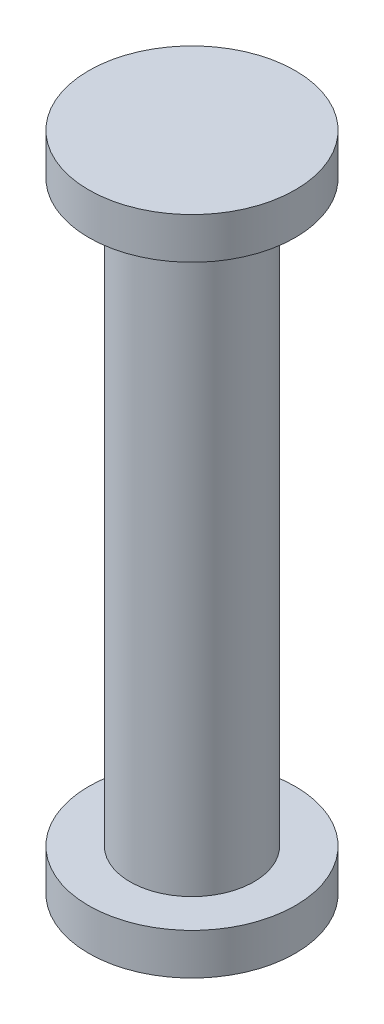
ISO-10303-21;
HEADER;
FILE_DESCRIPTION(('STEP AP214'),'2;1');
FILE_NAME('part.step','',(''),(''),'','','');
FILE_SCHEMA(('AUTOMOTIVE_DESIGN { 1 0 10303 214 1 1 1 1 }'));
ENDSEC;
DATA;
#1=APPLICATION_CONTEXT('core data for automotive mechanical design processes');
#2=APPLICATION_PROTOCOL_DEFINITION('international standard','automotive_design',2000,#1);
#3=PRODUCT_CONTEXT('',#1,'mechanical');
#4=PRODUCT('Part','Part','',(#3));
#5=PRODUCT_RELATED_PRODUCT_CATEGORY('part','',(#4));
#6=PRODUCT_DEFINITION_FORMATION('','',#4);
#7=PRODUCT_DEFINITION_CONTEXT('part definition',#1,'design');
#8=PRODUCT_DEFINITION('design','',#6,#7);
#9=PRODUCT_DEFINITION_SHAPE('','',#8);
#10=(LENGTH_UNIT() NAMED_UNIT(*) SI_UNIT(.MILLI.,.METRE.));
#11=(NAMED_UNIT(*) PLANE_ANGLE_UNIT() SI_UNIT($,.RADIAN.));
#12=(NAMED_UNIT(*) SI_UNIT($,.STERADIAN.) SOLID_ANGLE_UNIT());
#13=UNCERTAINTY_MEASURE_WITH_UNIT(LENGTH_MEASURE(1.E-05),#10,'distance_accuracy_value','');
#14=(GEOMETRIC_REPRESENTATION_CONTEXT(3) GLOBAL_UNCERTAINTY_ASSIGNED_CONTEXT((#13)) GLOBAL_UNIT_ASSIGNED_CONTEXT((#10,
#11,#12)) REPRESENTATION_CONTEXT('',''));
#15=CARTESIAN_POINT('',(0.,0.,0.));
#16=DIRECTION('',(0.,0.,1.));
#17=DIRECTION('',(1.,0.,0.));
#18=AXIS2_PLACEMENT_3D('',#15,#16,#17);
#19=CARTESIAN_POINT('',(-2.5,0.,0.));
#20=DIRECTION('',(0.,1.,0.));
#21=DIRECTION('',(0.,0.,1.));
#22=AXIS2_PLACEMENT_3D('',#19,#20,#21);
#23=PLANE('',#22);
#24=CARTESIAN_POINT('',(0.,0.,0.));
#25=DIRECTION('',(0.,-1.,0.));
#26=DIRECTION('',(0.,0.,-1.));
#27=AXIS2_PLACEMENT_3D('',#24,#25,#26);
#28=CIRCLE('',#27,2.5);
#29=CARTESIAN_POINT('',(0.,0.,-2.5));
#30=VERTEX_POINT('',#29);
#31=EDGE_CURVE('E55',#30,#30,#28,.T.);
#32=ORIENTED_EDGE('',*,*,#31,.T.);
#33=EDGE_LOOP('',(#32));
#34=FACE_BOUND('',#33,.T.);
#35=ADVANCED_FACE('F33',(#34),#23,.F.);
#36=CARTESIAN_POINT('',(0.,16.,0.));
#37=DIRECTION('',(0.,-1.,0.));
#38=DIRECTION('',(0.,0.,-1.));
#39=AXIS2_PLACEMENT_3D('',#36,#37,#38);
#40=PLANE('',#39);
#41=CARTESIAN_POINT('',(0.,16.,0.));
#42=DIRECTION('',(0.,-1.,0.));
#43=DIRECTION('',(0.,0.,-1.));
#44=AXIS2_PLACEMENT_3D('',#41,#42,#43);
#45=CIRCLE('',#44,2.5);
#46=CARTESIAN_POINT('',(0.,16.,-2.5));
#47=VERTEX_POINT('',#46);
#48=EDGE_CURVE('E10',#47,#47,#45,.T.);
#49=ORIENTED_EDGE('',*,*,#48,.F.);
#50=EDGE_LOOP('',(#49));
#51=FACE_BOUND('',#50,.T.);
#52=ADVANCED_FACE('F85',(#51),#40,.F.);
#53=CARTESIAN_POINT('',(0.,0.,0.));
#54=DIRECTION('',(0.,-1.,0.));
#55=DIRECTION('',(0.,0.,-1.));
#56=AXIS2_PLACEMENT_3D('',#53,#54,#55);
#57=CYLINDRICAL_SURFACE('',#56,2.5);
#58=CARTESIAN_POINT('',(0.,15.,0.));
#59=DIRECTION('',(0.,-1.,0.));
#60=DIRECTION('',(0.,0.,-1.));
#61=AXIS2_PLACEMENT_3D('',#58,#59,#60);
#62=CIRCLE('',#61,2.5);
#63=CARTESIAN_POINT('',(0.,15.,-2.5));
#64=VERTEX_POINT('',#63);
#65=EDGE_CURVE('E39',#64,#64,#62,.T.);
#66=ORIENTED_EDGE('',*,*,#65,.F.);
#67=EDGE_LOOP('',(#66));
#68=FACE_BOUND('',#67,.T.);
#69=ORIENTED_EDGE('',*,*,#48,.T.);
#70=EDGE_LOOP('',(#69));
#71=FACE_BOUND('',#70,.T.);
#72=ADVANCED_FACE('F80',(#68,#71),#57,.T.);
#73=CARTESIAN_POINT('',(-2.5,15.,0.));
#74=DIRECTION('',(0.,1.,0.));
#75=DIRECTION('',(0.,0.,1.));
#76=AXIS2_PLACEMENT_3D('',#73,#74,#75);
#77=PLANE('',#76);
#78=CARTESIAN_POINT('',(0.,15.,0.));
#79=DIRECTION('',(0.,-1.,0.));
#80=DIRECTION('',(0.,0.,-1.));
#81=AXIS2_PLACEMENT_3D('',#78,#79,#80);
#82=CIRCLE('',#81,1.5);
#83=CARTESIAN_POINT('',(0.,15.,-1.5));
#84=VERTEX_POINT('',#83);
#85=EDGE_CURVE('E43',#84,#84,#82,.T.);
#86=ORIENTED_EDGE('',*,*,#85,.F.);
#87=EDGE_LOOP('',(#86));
#88=FACE_BOUND('',#87,.T.);
#89=ORIENTED_EDGE('',*,*,#65,.T.);
#90=EDGE_LOOP('',(#89));
#91=FACE_BOUND('',#90,.T.);
#92=ADVANCED_FACE('F75',(#88,#91),#77,.F.);
#93=CARTESIAN_POINT('',(0.,0.,0.));
#94=DIRECTION('',(0.,-1.,0.));
#95=DIRECTION('',(0.,0.,-1.));
#96=AXIS2_PLACEMENT_3D('',#93,#94,#95);
#97=CYLINDRICAL_SURFACE('',#96,1.5);
#98=CARTESIAN_POINT('',(0.,1.,0.));
#99=DIRECTION('',(0.,-1.,0.));
#100=DIRECTION('',(0.,0.,-1.));
#101=AXIS2_PLACEMENT_3D('',#98,#99,#100);
#102=CIRCLE('',#101,1.5);
#103=CARTESIAN_POINT('',(0.,1.,-1.5));
#104=VERTEX_POINT('',#103);
#105=EDGE_CURVE('E47',#104,#104,#102,.T.);
#106=ORIENTED_EDGE('',*,*,#105,.F.);
#107=EDGE_LOOP('',(#106));
#108=FACE_BOUND('',#107,.T.);
#109=ORIENTED_EDGE('',*,*,#85,.T.);
#110=EDGE_LOOP('',(#109));
#111=FACE_BOUND('',#110,.T.);
#112=ADVANCED_FACE('F69',(#108,#111),#97,.T.);
#113=CARTESIAN_POINT('',(-1.5,1.,0.));
#114=DIRECTION('',(0.,-1.,0.));
#115=DIRECTION('',(0.,0.,-1.));
#116=AXIS2_PLACEMENT_3D('',#113,#114,#115);
#117=PLANE('',#116);
#118=CARTESIAN_POINT('',(0.,1.,0.));
#119=DIRECTION('',(0.,-1.,0.));
#120=DIRECTION('',(0.,0.,-1.));
#121=AXIS2_PLACEMENT_3D('',#118,#119,#120);
#122=CIRCLE('',#121,2.5);
#123=CARTESIAN_POINT('',(0.,1.,-2.5));
#124=VERTEX_POINT('',#123);
#125=EDGE_CURVE('E52',#124,#124,#122,.T.);
#126=ORIENTED_EDGE('',*,*,#125,.F.);
#127=EDGE_LOOP('',(#126));
#128=FACE_BOUND('',#127,.T.);
#129=ORIENTED_EDGE('',*,*,#105,.T.);
#130=EDGE_LOOP('',(#129));
#131=FACE_BOUND('',#130,.T.);
#132=ADVANCED_FACE('F63',(#128,#131),#117,.F.);
#133=CARTESIAN_POINT('',(0.,0.,0.));
#134=DIRECTION('',(0.,-1.,0.));
#135=DIRECTION('',(0.,0.,-1.));
#136=AXIS2_PLACEMENT_3D('',#133,#134,#135);
#137=CYLINDRICAL_SURFACE('',#136,2.5);
#138=ORIENTED_EDGE('',*,*,#31,.F.);
#139=EDGE_LOOP('',(#138));
#140=FACE_BOUND('',#139,.T.);
#141=ORIENTED_EDGE('',*,*,#125,.T.);
#142=EDGE_LOOP('',(#141));
#143=FACE_BOUND('',#142,.T.);
#144=ADVANCED_FACE('F60',(#140,#143),#137,.T.);
#145=CLOSED_SHELL('',(#35,#52,#72,#92,#112,#132,#144));
#146=MANIFOLD_SOLID_BREP('B2',#145);
#147=ADVANCED_BREP_SHAPE_REPRESENTATION('',(#18,#146),#14);
#148=SHAPE_DEFINITION_REPRESENTATION(#9,#147);
ENDSEC;
END-ISO-10303-21;
